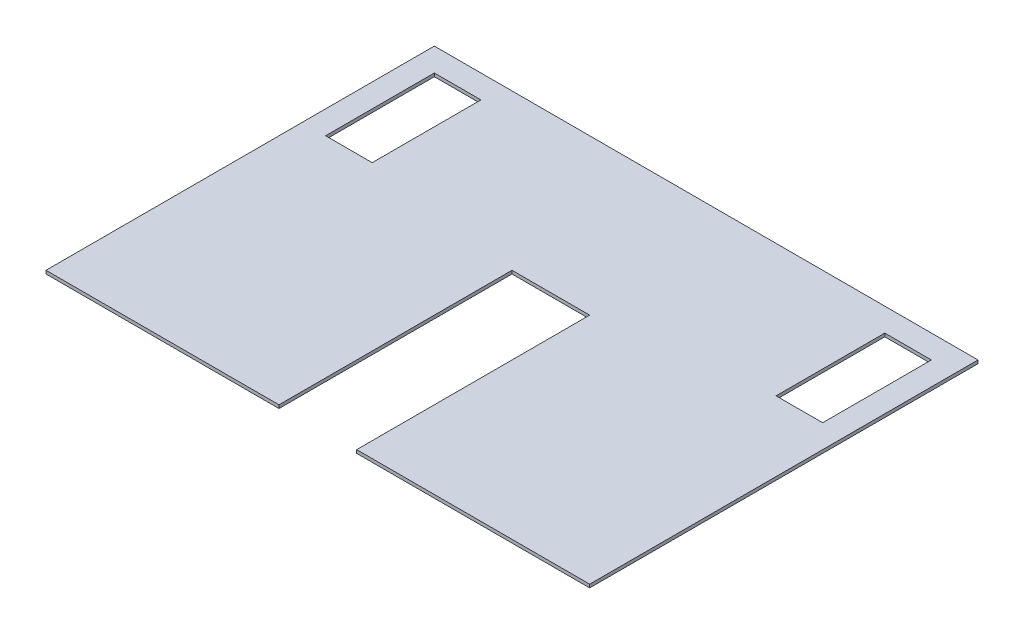
ISO-10303-21;
HEADER;
FILE_DESCRIPTION(('STEP AP214'),'2;1');
FILE_NAME('part.step','',(''),(''),'','','');
FILE_SCHEMA(('AUTOMOTIVE_DESIGN { 1 0 10303 214 1 1 1 1 }'));
ENDSEC;
DATA;
#1=APPLICATION_CONTEXT('core data for automotive mechanical design processes');
#2=APPLICATION_PROTOCOL_DEFINITION('international standard','automotive_design',2000,#1);
#3=PRODUCT_CONTEXT('',#1,'mechanical');
#4=PRODUCT('Part','Part','',(#3));
#5=PRODUCT_RELATED_PRODUCT_CATEGORY('part','',(#4));
#6=PRODUCT_DEFINITION_FORMATION('','',#4);
#7=PRODUCT_DEFINITION_CONTEXT('part definition',#1,'design');
#8=PRODUCT_DEFINITION('design','',#6,#7);
#9=PRODUCT_DEFINITION_SHAPE('','',#8);
#10=(LENGTH_UNIT() NAMED_UNIT(*) SI_UNIT(.MILLI.,.METRE.));
#11=(NAMED_UNIT(*) PLANE_ANGLE_UNIT() SI_UNIT($,.RADIAN.));
#12=(NAMED_UNIT(*) SI_UNIT($,.STERADIAN.) SOLID_ANGLE_UNIT());
#13=UNCERTAINTY_MEASURE_WITH_UNIT(LENGTH_MEASURE(1.E-05),#10,'distance_accuracy_value','');
#14=(GEOMETRIC_REPRESENTATION_CONTEXT(3) GLOBAL_UNCERTAINTY_ASSIGNED_CONTEXT((#13)) GLOBAL_UNIT_ASSIGNED_CONTEXT((#10,
#11,#12)) REPRESENTATION_CONTEXT('',''));
#15=CARTESIAN_POINT('',(0.,0.,0.));
#16=DIRECTION('',(0.,0.,1.));
#17=DIRECTION('',(1.,0.,0.));
#18=AXIS2_PLACEMENT_3D('',#15,#16,#17);
#19=CARTESIAN_POINT('',(0.,1.0668,0.));
#20=DIRECTION('',(0.,0.,-1.));
#21=DIRECTION('',(-1.,0.,0.));
#22=AXIS2_PLACEMENT_3D('',#19,#20,#21);
#23=PLANE('',#22);
#24=DIRECTION('',(1.,0.,0.));
#25=VECTOR('',#24,1.);
#26=CARTESIAN_POINT('',(0.,0.,0.));
#27=LINE('',#26,#25);
#28=CARTESIAN_POINT('',(-177.8,0.,0.));
#29=VERTEX_POINT('',#28);
#30=CARTESIAN_POINT('',(-101.6,0.,0.));
#31=VERTEX_POINT('',#30);
#32=EDGE_CURVE('E244',#29,#31,#27,.T.);
#33=ORIENTED_EDGE('',*,*,#32,.T.);
#34=DIRECTION('',(0.,1.,0.));
#35=VECTOR('',#34,1.);
#36=CARTESIAN_POINT('',(-101.6,0.,0.));
#37=LINE('',#36,#35);
#38=CARTESIAN_POINT('',(-101.6,1.0668,0.));
#39=VERTEX_POINT('',#38);
#40=EDGE_CURVE('E231',#31,#39,#37,.T.);
#41=ORIENTED_EDGE('',*,*,#40,.T.);
#42=DIRECTION('',(1.,0.,0.));
#43=VECTOR('',#42,1.);
#44=CARTESIAN_POINT('',(0.,1.0668,0.));
#45=LINE('',#44,#43);
#46=CARTESIAN_POINT('',(-177.8,1.0668,0.));
#47=VERTEX_POINT('',#46);
#48=EDGE_CURVE('E249',#47,#39,#45,.T.);
#49=ORIENTED_EDGE('',*,*,#48,.F.);
#50=DIRECTION('',(0.,-1.,0.));
#51=VECTOR('',#50,1.);
#52=CARTESIAN_POINT('',(-177.8,1.0668,0.));
#53=LINE('',#52,#51);
#54=EDGE_CURVE('E264',#47,#29,#53,.T.);
#55=ORIENTED_EDGE('',*,*,#54,.T.);
#56=EDGE_LOOP('',(#33,#41,#49,#55));
#57=FACE_BOUND('',#56,.T.);
#58=ADVANCED_FACE('F32',(#57),#23,.F.);
#59=CARTESIAN_POINT('',(0.,1.0668,0.));
#60=DIRECTION('',(-1.,0.,0.));
#61=DIRECTION('',(0.,0.,1.));
#62=AXIS2_PLACEMENT_3D('',#59,#60,#61);
#63=PLANE('',#62);
#64=DIRECTION('',(0.,0.,-1.));
#65=VECTOR('',#64,1.);
#66=CARTESIAN_POINT('',(0.,0.,0.));
#67=LINE('',#66,#65);
#68=CARTESIAN_POINT('',(0.,0.,0.));
#69=VERTEX_POINT('',#68);
#70=CARTESIAN_POINT('',(0.,0.,-127.));
#71=VERTEX_POINT('',#70);
#72=EDGE_CURVE('E234',#69,#71,#67,.T.);
#73=ORIENTED_EDGE('',*,*,#72,.T.);
#74=DIRECTION('',(0.,-1.,0.));
#75=VECTOR('',#74,1.);
#76=CARTESIAN_POINT('',(0.,1.0668,-127.));
#77=LINE('',#76,#75);
#78=CARTESIAN_POINT('',(0.,1.0668,-127.));
#79=VERTEX_POINT('',#78);
#80=EDGE_CURVE('E11',#79,#71,#77,.T.);
#81=ORIENTED_EDGE('',*,*,#80,.F.);
#82=DIRECTION('',(0.,0.,-1.));
#83=VECTOR('',#82,1.);
#84=CARTESIAN_POINT('',(0.,1.0668,0.));
#85=LINE('',#84,#83);
#86=CARTESIAN_POINT('',(0.,1.0668,0.));
#87=VERTEX_POINT('',#86);
#88=EDGE_CURVE('E240',#87,#79,#85,.T.);
#89=ORIENTED_EDGE('',*,*,#88,.F.);
#90=DIRECTION('',(0.,-1.,0.));
#91=VECTOR('',#90,1.);
#92=CARTESIAN_POINT('',(0.,1.0668,0.));
#93=LINE('',#92,#91);
#94=EDGE_CURVE('E252',#87,#69,#93,.T.);
#95=ORIENTED_EDGE('',*,*,#94,.T.);
#96=EDGE_LOOP('',(#73,#81,#89,#95));
#97=FACE_BOUND('',#96,.T.);
#98=ADVANCED_FACE('F34',(#97),#63,.F.);
#99=CARTESIAN_POINT('',(0.,1.0668,-127.));
#100=DIRECTION('',(0.,0.,1.));
#101=DIRECTION('',(1.,0.,0.));
#102=AXIS2_PLACEMENT_3D('',#99,#100,#101);
#103=PLANE('',#102);
#104=DIRECTION('',(-1.,0.,0.));
#105=VECTOR('',#104,1.);
#106=CARTESIAN_POINT('',(0.,0.,-127.));
#107=LINE('',#106,#105);
#108=CARTESIAN_POINT('',(-177.8,0.,-127.));
#109=VERTEX_POINT('',#108);
#110=EDGE_CURVE('E255',#71,#109,#107,.T.);
#111=ORIENTED_EDGE('',*,*,#110,.T.);
#112=DIRECTION('',(0.,-1.,0.));
#113=VECTOR('',#112,1.);
#114=CARTESIAN_POINT('',(-177.8,1.0668,-127.));
#115=LINE('',#114,#113);
#116=CARTESIAN_POINT('',(-177.8,1.0668,-127.));
#117=VERTEX_POINT('',#116);
#118=EDGE_CURVE('E40',#117,#109,#115,.T.);
#119=ORIENTED_EDGE('',*,*,#118,.F.);
#120=DIRECTION('',(-1.,0.,0.));
#121=VECTOR('',#120,1.);
#122=CARTESIAN_POINT('',(0.,1.0668,-127.));
#123=LINE('',#122,#121);
#124=EDGE_CURVE('E243',#79,#117,#123,.T.);
#125=ORIENTED_EDGE('',*,*,#124,.F.);
#126=ORIENTED_EDGE('',*,*,#80,.T.);
#127=EDGE_LOOP('',(#111,#119,#125,#126));
#128=FACE_BOUND('',#127,.T.);
#129=ADVANCED_FACE('F286',(#128),#103,.F.);
#130=CARTESIAN_POINT('',(-177.8,1.0668,0.));
#131=DIRECTION('',(1.,0.,0.));
#132=DIRECTION('',(0.,0.,-1.));
#133=AXIS2_PLACEMENT_3D('',#130,#131,#132);
#134=PLANE('',#133);
#135=DIRECTION('',(0.,0.,1.));
#136=VECTOR('',#135,1.);
#137=CARTESIAN_POINT('',(-177.8,0.,0.));
#138=LINE('',#137,#136);
#139=EDGE_CURVE('E257',#109,#29,#138,.T.);
#140=ORIENTED_EDGE('',*,*,#139,.T.);
#141=ORIENTED_EDGE('',*,*,#54,.F.);
#142=DIRECTION('',(0.,0.,1.));
#143=VECTOR('',#142,1.);
#144=CARTESIAN_POINT('',(-177.8,1.0668,0.));
#145=LINE('',#144,#143);
#146=EDGE_CURVE('E246',#117,#47,#145,.T.);
#147=ORIENTED_EDGE('',*,*,#146,.F.);
#148=ORIENTED_EDGE('',*,*,#118,.T.);
#149=EDGE_LOOP('',(#140,#141,#147,#148));
#150=FACE_BOUND('',#149,.T.);
#151=ADVANCED_FACE('F271',(#150),#134,.F.);
#152=CARTESIAN_POINT('',(-76.1999999999999,1.0668,0.));
#153=VERTEX_POINT('',#152);
#154=EDGE_CURVE('E248',#153,#87,#45,.T.);
#155=ORIENTED_EDGE('',*,*,#154,.F.);
#156=DIRECTION('',(0.,1.,0.));
#157=VECTOR('',#156,1.);
#158=CARTESIAN_POINT('',(-76.1999999999999,0.,0.));
#159=LINE('',#158,#157);
#160=CARTESIAN_POINT('',(-76.1999999999999,0.,0.));
#161=VERTEX_POINT('',#160);
#162=EDGE_CURVE('E224',#161,#153,#159,.T.);
#163=ORIENTED_EDGE('',*,*,#162,.F.);
#164=EDGE_CURVE('E259',#161,#69,#27,.T.);
#165=ORIENTED_EDGE('',*,*,#164,.T.);
#166=ORIENTED_EDGE('',*,*,#94,.F.);
#167=EDGE_LOOP('',(#155,#163,#165,#166));
#168=FACE_BOUND('',#167,.T.);
#169=ADVANCED_FACE('F293',(#168),#23,.F.);
#170=CARTESIAN_POINT('',(0.,1.0668,0.));
#171=DIRECTION('',(0.,1.,0.));
#172=DIRECTION('',(0.,0.,1.));
#173=AXIS2_PLACEMENT_3D('',#170,#171,#172);
#174=PLANE('',#173);
#175=DIRECTION('',(-1.,0.,0.));
#176=VECTOR('',#175,1.);
#177=CARTESIAN_POINT('',(-7.62000000000001,1.0668,-119.38));
#178=LINE('',#177,#176);
#179=CARTESIAN_POINT('',(-7.62000000000001,1.0668,-119.38));
#180=VERTEX_POINT('',#179);
#181=CARTESIAN_POINT('',(-22.8599999999999,1.0668,-119.38));
#182=VERTEX_POINT('',#181);
#183=EDGE_CURVE('E47',#180,#182,#178,.T.);
#184=ORIENTED_EDGE('',*,*,#183,.F.);
#185=DIRECTION('',(0.,0.,-1.));
#186=VECTOR('',#185,1.);
#187=CARTESIAN_POINT('',(-7.62000000000001,1.0668,-119.38));
#188=LINE('',#187,#186);
#189=CARTESIAN_POINT('',(-7.62000000000001,1.0668,-83.8199999999995));
#190=VERTEX_POINT('',#189);
#191=EDGE_CURVE('E163',#190,#180,#188,.T.);
#192=ORIENTED_EDGE('',*,*,#191,.F.);
#193=DIRECTION('',(1.,0.,0.));
#194=VECTOR('',#193,1.);
#195=CARTESIAN_POINT('',(-22.8599999999999,1.0668,-83.8199999999995));
#196=LINE('',#195,#194);
#197=CARTESIAN_POINT('',(-22.8599999999999,1.0668,-83.8199999999995));
#198=VERTEX_POINT('',#197);
#199=EDGE_CURVE('E166',#198,#190,#196,.T.);
#200=ORIENTED_EDGE('',*,*,#199,.F.);
#201=DIRECTION('',(0.,0.,1.));
#202=VECTOR('',#201,1.);
#203=CARTESIAN_POINT('',(-22.8599999999999,1.0668,-119.38));
#204=LINE('',#203,#202);
#205=EDGE_CURVE('E172',#182,#198,#204,.T.);
#206=ORIENTED_EDGE('',*,*,#205,.F.);
#207=EDGE_LOOP('',(#184,#192,#200,#206));
#208=FACE_BOUND('',#207,.T.);
#209=DIRECTION('',(0.,0.,1.));
#210=VECTOR('',#209,1.);
#211=CARTESIAN_POINT('',(-170.18,1.0668,-119.38));
#212=LINE('',#211,#210);
#213=CARTESIAN_POINT('',(-170.18,1.0668,-119.38));
#214=VERTEX_POINT('',#213);
#215=CARTESIAN_POINT('',(-170.18,1.0668,-83.8200000000001));
#216=VERTEX_POINT('',#215);
#217=EDGE_CURVE('E178',#214,#216,#212,.T.);
#218=ORIENTED_EDGE('',*,*,#217,.F.);
#219=DIRECTION('',(-1.,0.,0.));
#220=VECTOR('',#219,1.);
#221=CARTESIAN_POINT('',(-154.94,1.0668,-119.38));
#222=LINE('',#221,#220);
#223=CARTESIAN_POINT('',(-154.94,1.0668,-119.38));
#224=VERTEX_POINT('',#223);
#225=EDGE_CURVE('E186',#224,#214,#222,.T.);
#226=ORIENTED_EDGE('',*,*,#225,.F.);
#227=DIRECTION('',(0.,0.,-1.));
#228=VECTOR('',#227,1.);
#229=CARTESIAN_POINT('',(-154.94,1.0668,-83.8200000000001));
#230=LINE('',#229,#228);
#231=CARTESIAN_POINT('',(-154.94,1.0668,-83.8200000000001));
#232=VERTEX_POINT('',#231);
#233=EDGE_CURVE('E200',#232,#224,#230,.T.);
#234=ORIENTED_EDGE('',*,*,#233,.F.);
#235=DIRECTION('',(1.,0.,0.));
#236=VECTOR('',#235,1.);
#237=CARTESIAN_POINT('',(-170.18,1.0668,-83.8200000000001));
#238=LINE('',#237,#236);
#239=EDGE_CURVE('E197',#216,#232,#238,.T.);
#240=ORIENTED_EDGE('',*,*,#239,.F.);
#241=EDGE_LOOP('',(#218,#226,#234,#240));
#242=FACE_BOUND('',#241,.T.);
#243=DIRECTION('',(0.,0.,1.));
#244=VECTOR('',#243,1.);
#245=CARTESIAN_POINT('',(-101.6,1.0668,-76.1999999999995));
#246=LINE('',#245,#244);
#247=CARTESIAN_POINT('',(-101.6,1.0668,-76.1999999999995));
#248=VERTEX_POINT('',#247);
#249=EDGE_CURVE('E218',#248,#39,#246,.T.);
#250=ORIENTED_EDGE('',*,*,#249,.F.);
#251=DIRECTION('',(-1.,0.,0.));
#252=VECTOR('',#251,1.);
#253=CARTESIAN_POINT('',(-101.6,1.0668,-76.1999999999995));
#254=LINE('',#253,#252);
#255=CARTESIAN_POINT('',(-76.1999999999998,1.0668,-76.1999999999995));
#256=VERTEX_POINT('',#255);
#257=EDGE_CURVE('E227',#256,#248,#254,.T.);
#258=ORIENTED_EDGE('',*,*,#257,.F.);
#259=DIRECTION('',(0.,0.,-1.));
#260=VECTOR('',#259,1.);
#261=CARTESIAN_POINT('',(-76.1999999999998,1.0668,-76.1999999999995));
#262=LINE('',#261,#260);
#263=EDGE_CURVE('E207',#153,#256,#262,.T.);
#264=ORIENTED_EDGE('',*,*,#263,.F.);
#265=ORIENTED_EDGE('',*,*,#154,.T.);
#266=ORIENTED_EDGE('',*,*,#88,.T.);
#267=ORIENTED_EDGE('',*,*,#124,.T.);
#268=ORIENTED_EDGE('',*,*,#146,.T.);
#269=ORIENTED_EDGE('',*,*,#48,.T.);
#270=EDGE_LOOP('',(#250,#258,#264,#265,#266,#267,#268,#269));
#271=FACE_BOUND('',#270,.T.);
#272=ADVANCED_FACE('F282',(#208,#242,#271),#174,.T.);
#273=CARTESIAN_POINT('',(0.,0.,0.));
#274=DIRECTION('',(0.,1.,0.));
#275=DIRECTION('',(0.,0.,1.));
#276=AXIS2_PLACEMENT_3D('',#273,#274,#275);
#277=PLANE('',#276);
#278=DIRECTION('',(0.,0.,-1.));
#279=VECTOR('',#278,1.);
#280=CARTESIAN_POINT('',(-7.62000000000001,0.,-119.38));
#281=LINE('',#280,#279);
#282=CARTESIAN_POINT('',(-7.62000000000001,0.,-83.8199999999995));
#283=VERTEX_POINT('',#282);
#284=CARTESIAN_POINT('',(-7.62000000000001,0.,-119.38));
#285=VERTEX_POINT('',#284);
#286=EDGE_CURVE('E153',#283,#285,#281,.T.);
#287=ORIENTED_EDGE('',*,*,#286,.T.);
#288=DIRECTION('',(-1.,0.,0.));
#289=VECTOR('',#288,1.);
#290=CARTESIAN_POINT('',(-7.62000000000001,0.,-119.38));
#291=LINE('',#290,#289);
#292=CARTESIAN_POINT('',(-22.8599999999999,0.,-119.38));
#293=VERTEX_POINT('',#292);
#294=EDGE_CURVE('E147',#285,#293,#291,.T.);
#295=ORIENTED_EDGE('',*,*,#294,.T.);
#296=DIRECTION('',(0.,0.,1.));
#297=VECTOR('',#296,1.);
#298=CARTESIAN_POINT('',(-22.8599999999999,0.,-119.38));
#299=LINE('',#298,#297);
#300=CARTESIAN_POINT('',(-22.8599999999999,0.,-83.8199999999995));
#301=VERTEX_POINT('',#300);
#302=EDGE_CURVE('E156',#293,#301,#299,.T.);
#303=ORIENTED_EDGE('',*,*,#302,.T.);
#304=DIRECTION('',(1.,0.,0.));
#305=VECTOR('',#304,1.);
#306=CARTESIAN_POINT('',(-22.8599999999999,0.,-83.8199999999995));
#307=LINE('',#306,#305);
#308=EDGE_CURVE('E55',#301,#283,#307,.T.);
#309=ORIENTED_EDGE('',*,*,#308,.T.);
#310=EDGE_LOOP('',(#287,#295,#303,#309));
#311=FACE_BOUND('',#310,.T.);
#312=DIRECTION('',(-1.,0.,0.));
#313=VECTOR('',#312,1.);
#314=CARTESIAN_POINT('',(-154.94,0.,-119.38));
#315=LINE('',#314,#313);
#316=CARTESIAN_POINT('',(-154.94,0.,-119.38));
#317=VERTEX_POINT('',#316);
#318=CARTESIAN_POINT('',(-170.18,0.,-119.38));
#319=VERTEX_POINT('',#318);
#320=EDGE_CURVE('E192',#317,#319,#315,.T.);
#321=ORIENTED_EDGE('',*,*,#320,.T.);
#322=DIRECTION('',(0.,0.,1.));
#323=VECTOR('',#322,1.);
#324=CARTESIAN_POINT('',(-170.18,0.,-119.38));
#325=LINE('',#324,#323);
#326=CARTESIAN_POINT('',(-170.18,0.,-83.8200000000001));
#327=VERTEX_POINT('',#326);
#328=EDGE_CURVE('E182',#319,#327,#325,.T.);
#329=ORIENTED_EDGE('',*,*,#328,.T.);
#330=DIRECTION('',(1.,0.,0.));
#331=VECTOR('',#330,1.);
#332=CARTESIAN_POINT('',(-170.18,0.,-83.8200000000001));
#333=LINE('',#332,#331);
#334=CARTESIAN_POINT('',(-154.94,0.,-83.8200000000001));
#335=VERTEX_POINT('',#334);
#336=EDGE_CURVE('E185',#327,#335,#333,.T.);
#337=ORIENTED_EDGE('',*,*,#336,.T.);
#338=DIRECTION('',(0.,0.,-1.));
#339=VECTOR('',#338,1.);
#340=CARTESIAN_POINT('',(-154.94,0.,-83.8200000000001));
#341=LINE('',#340,#339);
#342=EDGE_CURVE('E189',#335,#317,#341,.T.);
#343=ORIENTED_EDGE('',*,*,#342,.T.);
#344=EDGE_LOOP('',(#321,#329,#337,#343));
#345=FACE_BOUND('',#344,.T.);
#346=DIRECTION('',(-1.,0.,0.));
#347=VECTOR('',#346,1.);
#348=CARTESIAN_POINT('',(-101.6,0.,-76.1999999999995));
#349=LINE('',#348,#347);
#350=CARTESIAN_POINT('',(-76.1999999999998,0.,-76.1999999999995));
#351=VERTEX_POINT('',#350);
#352=CARTESIAN_POINT('',(-101.6,0.,-76.1999999999995));
#353=VERTEX_POINT('',#352);
#354=EDGE_CURVE('E217',#351,#353,#349,.T.);
#355=ORIENTED_EDGE('',*,*,#354,.T.);
#356=DIRECTION('',(0.,0.,1.));
#357=VECTOR('',#356,1.);
#358=CARTESIAN_POINT('',(-101.6,0.,-76.1999999999995));
#359=LINE('',#358,#357);
#360=EDGE_CURVE('E221',#353,#31,#359,.T.);
#361=ORIENTED_EDGE('',*,*,#360,.T.);
#362=ORIENTED_EDGE('',*,*,#32,.F.);
#363=ORIENTED_EDGE('',*,*,#139,.F.);
#364=ORIENTED_EDGE('',*,*,#110,.F.);
#365=ORIENTED_EDGE('',*,*,#72,.F.);
#366=ORIENTED_EDGE('',*,*,#164,.F.);
#367=DIRECTION('',(0.,0.,-1.));
#368=VECTOR('',#367,1.);
#369=CARTESIAN_POINT('',(-76.1999999999998,0.,-76.1999999999995));
#370=LINE('',#369,#368);
#371=EDGE_CURVE('E214',#161,#351,#370,.T.);
#372=ORIENTED_EDGE('',*,*,#371,.T.);
#373=EDGE_LOOP('',(#355,#361,#362,#363,#364,#365,#366,#372));
#374=FACE_BOUND('',#373,.T.);
#375=ADVANCED_FACE('F160',(#311,#345,#374),#277,.F.);
#376=CARTESIAN_POINT('',(-101.6,0.,-76.1999999999995));
#377=DIRECTION('',(-1.,0.,0.));
#378=DIRECTION('',(0.,0.,1.));
#379=AXIS2_PLACEMENT_3D('',#376,#377,#378);
#380=PLANE('',#379);
#381=ORIENTED_EDGE('',*,*,#249,.T.);
#382=ORIENTED_EDGE('',*,*,#40,.F.);
#383=ORIENTED_EDGE('',*,*,#360,.F.);
#384=DIRECTION('',(0.,1.,0.));
#385=VECTOR('',#384,1.);
#386=CARTESIAN_POINT('',(-101.6,0.,-76.1999999999995));
#387=LINE('',#386,#385);
#388=EDGE_CURVE('E235',#353,#248,#387,.T.);
#389=ORIENTED_EDGE('',*,*,#388,.T.);
#390=EDGE_LOOP('',(#381,#382,#383,#389));
#391=FACE_BOUND('',#390,.T.);
#392=ADVANCED_FACE('F301',(#391),#380,.F.);
#393=CARTESIAN_POINT('',(-101.6,0.,-76.1999999999995));
#394=DIRECTION('',(0.,0.,-1.));
#395=DIRECTION('',(-1.,0.,0.));
#396=AXIS2_PLACEMENT_3D('',#393,#394,#395);
#397=PLANE('',#396);
#398=ORIENTED_EDGE('',*,*,#257,.T.);
#399=ORIENTED_EDGE('',*,*,#388,.F.);
#400=ORIENTED_EDGE('',*,*,#354,.F.);
#401=DIRECTION('',(0.,1.,0.));
#402=VECTOR('',#401,1.);
#403=CARTESIAN_POINT('',(-76.1999999999998,0.,-76.1999999999995));
#404=LINE('',#403,#402);
#405=EDGE_CURVE('E237',#351,#256,#404,.T.);
#406=ORIENTED_EDGE('',*,*,#405,.T.);
#407=EDGE_LOOP('',(#398,#399,#400,#406));
#408=FACE_BOUND('',#407,.T.);
#409=ADVANCED_FACE('F299',(#408),#397,.F.);
#410=CARTESIAN_POINT('',(-76.1999999999998,0.,-76.1999999999995));
#411=DIRECTION('',(1.,0.,0.));
#412=DIRECTION('',(0.,0.,-1.));
#413=AXIS2_PLACEMENT_3D('',#410,#411,#412);
#414=PLANE('',#413);
#415=ORIENTED_EDGE('',*,*,#263,.T.);
#416=ORIENTED_EDGE('',*,*,#405,.F.);
#417=ORIENTED_EDGE('',*,*,#371,.F.);
#418=ORIENTED_EDGE('',*,*,#162,.T.);
#419=EDGE_LOOP('',(#415,#416,#417,#418));
#420=FACE_BOUND('',#419,.T.);
#421=ADVANCED_FACE('F296',(#420),#414,.F.);
#422=CARTESIAN_POINT('',(-170.18,0.,-119.38));
#423=DIRECTION('',(-1.,0.,0.));
#424=DIRECTION('',(0.,0.,1.));
#425=AXIS2_PLACEMENT_3D('',#422,#423,#424);
#426=PLANE('',#425);
#427=ORIENTED_EDGE('',*,*,#217,.T.);
#428=DIRECTION('',(0.,1.,0.));
#429=VECTOR('',#428,1.);
#430=CARTESIAN_POINT('',(-170.18,0.,-83.8200000000001));
#431=LINE('',#430,#429);
#432=EDGE_CURVE('E195',#327,#216,#431,.T.);
#433=ORIENTED_EDGE('',*,*,#432,.F.);
#434=ORIENTED_EDGE('',*,*,#328,.F.);
#435=DIRECTION('',(0.,1.,0.));
#436=VECTOR('',#435,1.);
#437=CARTESIAN_POINT('',(-170.18,0.,-119.38));
#438=LINE('',#437,#436);
#439=EDGE_CURVE('E205',#319,#214,#438,.T.);
#440=ORIENTED_EDGE('',*,*,#439,.T.);
#441=EDGE_LOOP('',(#427,#433,#434,#440));
#442=FACE_BOUND('',#441,.T.);
#443=ADVANCED_FACE('F376',(#442),#426,.F.);
#444=CARTESIAN_POINT('',(-154.94,0.,-119.38));
#445=DIRECTION('',(0.,0.,-1.));
#446=DIRECTION('',(-1.,0.,0.));
#447=AXIS2_PLACEMENT_3D('',#444,#445,#446);
#448=PLANE('',#447);
#449=ORIENTED_EDGE('',*,*,#225,.T.);
#450=ORIENTED_EDGE('',*,*,#439,.F.);
#451=ORIENTED_EDGE('',*,*,#320,.F.);
#452=DIRECTION('',(0.,1.,0.));
#453=VECTOR('',#452,1.);
#454=CARTESIAN_POINT('',(-154.94,0.,-119.38));
#455=LINE('',#454,#453);
#456=EDGE_CURVE('E208',#317,#224,#455,.T.);
#457=ORIENTED_EDGE('',*,*,#456,.T.);
#458=EDGE_LOOP('',(#449,#450,#451,#457));
#459=FACE_BOUND('',#458,.T.);
#460=ADVANCED_FACE('F384',(#459),#448,.F.);
#461=CARTESIAN_POINT('',(-154.94,0.,-83.8200000000001));
#462=DIRECTION('',(1.,0.,0.));
#463=DIRECTION('',(0.,0.,-1.));
#464=AXIS2_PLACEMENT_3D('',#461,#462,#463);
#465=PLANE('',#464);
#466=ORIENTED_EDGE('',*,*,#233,.T.);
#467=ORIENTED_EDGE('',*,*,#456,.F.);
#468=ORIENTED_EDGE('',*,*,#342,.F.);
#469=DIRECTION('',(0.,1.,0.));
#470=VECTOR('',#469,1.);
#471=CARTESIAN_POINT('',(-154.94,0.,-83.8200000000001));
#472=LINE('',#471,#470);
#473=EDGE_CURVE('E210',#335,#232,#472,.T.);
#474=ORIENTED_EDGE('',*,*,#473,.T.);
#475=EDGE_LOOP('',(#466,#467,#468,#474));
#476=FACE_BOUND('',#475,.T.);
#477=ADVANCED_FACE('F392',(#476),#465,.F.);
#478=CARTESIAN_POINT('',(-170.18,0.,-83.8200000000001));
#479=DIRECTION('',(0.,0.,1.));
#480=DIRECTION('',(1.,0.,0.));
#481=AXIS2_PLACEMENT_3D('',#478,#479,#480);
#482=PLANE('',#481);
#483=ORIENTED_EDGE('',*,*,#239,.T.);
#484=ORIENTED_EDGE('',*,*,#473,.F.);
#485=ORIENTED_EDGE('',*,*,#336,.F.);
#486=ORIENTED_EDGE('',*,*,#432,.T.);
#487=EDGE_LOOP('',(#483,#484,#485,#486));
#488=FACE_BOUND('',#487,.T.);
#489=ADVANCED_FACE('F401',(#488),#482,.F.);
#490=CARTESIAN_POINT('',(-7.62000000000001,0.,-119.38));
#491=DIRECTION('',(0.,0.,-1.));
#492=DIRECTION('',(-1.,0.,0.));
#493=AXIS2_PLACEMENT_3D('',#490,#491,#492);
#494=PLANE('',#493);
#495=ORIENTED_EDGE('',*,*,#183,.T.);
#496=DIRECTION('',(0.,1.,0.));
#497=VECTOR('',#496,1.);
#498=CARTESIAN_POINT('',(-22.8599999999999,0.,-119.38));
#499=LINE('',#498,#497);
#500=EDGE_CURVE('E143',#293,#182,#499,.T.);
#501=ORIENTED_EDGE('',*,*,#500,.F.);
#502=ORIENTED_EDGE('',*,*,#294,.F.);
#503=DIRECTION('',(0.,1.,0.));
#504=VECTOR('',#503,1.);
#505=CARTESIAN_POINT('',(-7.62000000000001,0.,-119.38));
#506=LINE('',#505,#504);
#507=EDGE_CURVE('E176',#285,#180,#506,.T.);
#508=ORIENTED_EDGE('',*,*,#507,.T.);
#509=EDGE_LOOP('',(#495,#501,#502,#508));
#510=FACE_BOUND('',#509,.T.);
#511=ADVANCED_FACE('F145',(#510),#494,.F.);
#512=CARTESIAN_POINT('',(-7.62000000000001,0.,-119.38));
#513=DIRECTION('',(1.,0.,0.));
#514=DIRECTION('',(0.,0.,-1.));
#515=AXIS2_PLACEMENT_3D('',#512,#513,#514);
#516=PLANE('',#515);
#517=ORIENTED_EDGE('',*,*,#191,.T.);
#518=ORIENTED_EDGE('',*,*,#507,.F.);
#519=ORIENTED_EDGE('',*,*,#286,.F.);
#520=DIRECTION('',(0.,1.,0.));
#521=VECTOR('',#520,1.);
#522=CARTESIAN_POINT('',(-7.62000000000001,0.,-83.8199999999995));
#523=LINE('',#522,#521);
#524=EDGE_CURVE('E179',#283,#190,#523,.T.);
#525=ORIENTED_EDGE('',*,*,#524,.T.);
#526=EDGE_LOOP('',(#517,#518,#519,#525));
#527=FACE_BOUND('',#526,.T.);
#528=ADVANCED_FACE('F418',(#527),#516,.F.);
#529=CARTESIAN_POINT('',(-22.8599999999999,0.,-83.8199999999995));
#530=DIRECTION('',(0.,0.,1.));
#531=DIRECTION('',(1.,0.,0.));
#532=AXIS2_PLACEMENT_3D('',#529,#530,#531);
#533=PLANE('',#532);
#534=ORIENTED_EDGE('',*,*,#199,.T.);
#535=ORIENTED_EDGE('',*,*,#524,.F.);
#536=ORIENTED_EDGE('',*,*,#308,.F.);
#537=DIRECTION('',(0.,1.,0.));
#538=VECTOR('',#537,1.);
#539=CARTESIAN_POINT('',(-22.8599999999999,0.,-83.8199999999995));
#540=LINE('',#539,#538);
#541=EDGE_CURVE('E152',#301,#198,#540,.T.);
#542=ORIENTED_EDGE('',*,*,#541,.T.);
#543=EDGE_LOOP('',(#534,#535,#536,#542));
#544=FACE_BOUND('',#543,.T.);
#545=ADVANCED_FACE('F426',(#544),#533,.F.);
#546=CARTESIAN_POINT('',(-22.8599999999999,0.,-119.38));
#547=DIRECTION('',(-1.,0.,0.));
#548=DIRECTION('',(0.,0.,1.));
#549=AXIS2_PLACEMENT_3D('',#546,#547,#548);
#550=PLANE('',#549);
#551=ORIENTED_EDGE('',*,*,#205,.T.);
#552=ORIENTED_EDGE('',*,*,#541,.F.);
#553=ORIENTED_EDGE('',*,*,#302,.F.);
#554=ORIENTED_EDGE('',*,*,#500,.T.);
#555=EDGE_LOOP('',(#551,#552,#553,#554));
#556=FACE_BOUND('',#555,.T.);
#557=ADVANCED_FACE('F157',(#556),#550,.F.);
#558=CLOSED_SHELL('',(#58,#98,#129,#151,#169,#272,#375,#392,#409,#421,#443,#460,#477,#489,#511,
#528,#545,#557));
#559=MANIFOLD_SOLID_BREP('B2',#558);
#560=ADVANCED_BREP_SHAPE_REPRESENTATION('',(#18,#559),#14);
#561=SHAPE_DEFINITION_REPRESENTATION(#9,#560);
ENDSEC;
END-ISO-10303-21;
